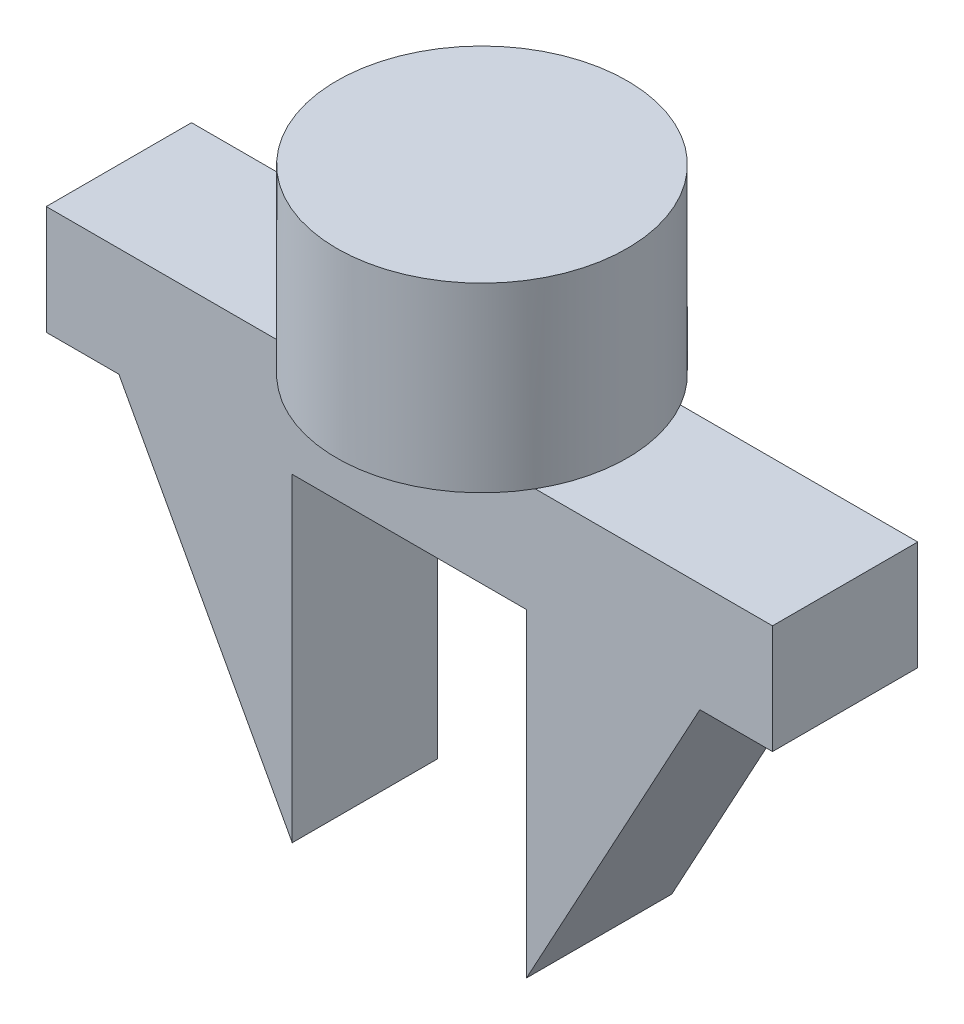
ISO-10303-21;
HEADER;
FILE_DESCRIPTION(('STEP AP214'),'2;1');
FILE_NAME('part.step','',(''),(''),'','','');
FILE_SCHEMA(('AUTOMOTIVE_DESIGN { 1 0 10303 214 1 1 1 1 }'));
ENDSEC;
DATA;
#1=APPLICATION_CONTEXT('core data for automotive mechanical design processes');
#2=APPLICATION_PROTOCOL_DEFINITION('international standard','automotive_design',2000,#1);
#3=PRODUCT_CONTEXT('',#1,'mechanical');
#4=PRODUCT('Part','Part','',(#3));
#5=PRODUCT_RELATED_PRODUCT_CATEGORY('part','',(#4));
#6=PRODUCT_DEFINITION_FORMATION('','',#4);
#7=PRODUCT_DEFINITION_CONTEXT('part definition',#1,'design');
#8=PRODUCT_DEFINITION('design','',#6,#7);
#9=PRODUCT_DEFINITION_SHAPE('','',#8);
#10=(LENGTH_UNIT() NAMED_UNIT(*) SI_UNIT(.MILLI.,.METRE.));
#11=(NAMED_UNIT(*) PLANE_ANGLE_UNIT() SI_UNIT($,.RADIAN.));
#12=(NAMED_UNIT(*) SI_UNIT($,.STERADIAN.) SOLID_ANGLE_UNIT());
#13=UNCERTAINTY_MEASURE_WITH_UNIT(LENGTH_MEASURE(1.E-05),#10,'distance_accuracy_value','');
#14=(GEOMETRIC_REPRESENTATION_CONTEXT(3) GLOBAL_UNCERTAINTY_ASSIGNED_CONTEXT((#13)) GLOBAL_UNIT_ASSIGNED_CONTEXT((#10,
#11,#12)) REPRESENTATION_CONTEXT('',''));
#15=CARTESIAN_POINT('',(0.,0.,0.));
#16=DIRECTION('',(0.,0.,1.));
#17=DIRECTION('',(1.,0.,0.));
#18=AXIS2_PLACEMENT_3D('',#15,#16,#17);
#19=CARTESIAN_POINT('',(0.,0.,20.));
#20=DIRECTION('',(0.,-1.,0.));
#21=DIRECTION('',(0.,0.,-1.));
#22=AXIS2_PLACEMENT_3D('',#19,#20,#21);
#23=PLANE('',#22);
#24=CARTESIAN_POINT('',(0.,0.,10.));
#25=DIRECTION('',(0.,1.,0.));
#26=DIRECTION('',(0.,0.,1.));
#27=AXIS2_PLACEMENT_3D('',#24,#25,#26);
#28=CIRCLE('',#27,20.);
#29=CARTESIAN_POINT('',(17.3205080756888,0.,20.));
#30=VERTEX_POINT('',#29);
#31=CARTESIAN_POINT('',(17.3205080756888,0.,0.));
#32=VERTEX_POINT('',#31);
#33=EDGE_CURVE('E47',#30,#32,#28,.T.);
#34=ORIENTED_EDGE('',*,*,#33,.F.);
#35=DIRECTION('',(-1.,0.,0.));
#36=VECTOR('',#35,1.);
#37=CARTESIAN_POINT('',(0.,0.,20.));
#38=LINE('',#37,#36);
#39=CARTESIAN_POINT('',(50.,0.,20.));
#40=VERTEX_POINT('',#39);
#41=EDGE_CURVE('E133',#40,#30,#38,.T.);
#42=ORIENTED_EDGE('',*,*,#41,.F.);
#43=DIRECTION('',(0.,0.,-1.));
#44=VECTOR('',#43,1.);
#45=CARTESIAN_POINT('',(50.,0.,20.));
#46=LINE('',#45,#44);
#47=CARTESIAN_POINT('',(50.,0.,0.));
#48=VERTEX_POINT('',#47);
#49=EDGE_CURVE('E215',#40,#48,#46,.T.);
#50=ORIENTED_EDGE('',*,*,#49,.T.);
#51=DIRECTION('',(-1.,0.,0.));
#52=VECTOR('',#51,1.);
#53=CARTESIAN_POINT('',(0.,0.,0.));
#54=LINE('',#53,#52);
#55=EDGE_CURVE('E193',#48,#32,#54,.T.);
#56=ORIENTED_EDGE('',*,*,#55,.T.);
#57=EDGE_LOOP('',(#34,#42,#50,#56));
#58=FACE_BOUND('',#57,.T.);
#59=ADVANCED_FACE('F37',(#58),#23,.F.);
#60=CARTESIAN_POINT('',(0.,-15.,20.));
#61=DIRECTION('',(0.,1.,0.));
#62=DIRECTION('',(0.,0.,1.));
#63=AXIS2_PLACEMENT_3D('',#60,#61,#62);
#64=PLANE('',#63);
#65=DIRECTION('',(1.,0.,0.));
#66=VECTOR('',#65,1.);
#67=CARTESIAN_POINT('',(0.,-15.,0.));
#68=LINE('',#67,#66);
#69=CARTESIAN_POINT('',(-16.1276932074143,-15.,0.));
#70=VERTEX_POINT('',#69);
#71=CARTESIAN_POINT('',(16.1276932074143,-15.,0.));
#72=VERTEX_POINT('',#71);
#73=EDGE_CURVE('E177',#70,#72,#68,.T.);
#74=ORIENTED_EDGE('',*,*,#73,.T.);
#75=DIRECTION('',(0.,0.,-1.));
#76=VECTOR('',#75,1.);
#77=CARTESIAN_POINT('',(16.1276932074143,-15.,20.));
#78=LINE('',#77,#76);
#79=CARTESIAN_POINT('',(16.1276932074143,-15.,20.));
#80=VERTEX_POINT('',#79);
#81=EDGE_CURVE('E41',#80,#72,#78,.T.);
#82=ORIENTED_EDGE('',*,*,#81,.F.);
#83=DIRECTION('',(1.,0.,0.));
#84=VECTOR('',#83,1.);
#85=CARTESIAN_POINT('',(0.,-15.,20.));
#86=LINE('',#85,#84);
#87=CARTESIAN_POINT('',(-16.1276932074143,-15.,20.));
#88=VERTEX_POINT('',#87);
#89=EDGE_CURVE('E154',#88,#80,#86,.T.);
#90=ORIENTED_EDGE('',*,*,#89,.F.);
#91=DIRECTION('',(0.,0.,-1.));
#92=VECTOR('',#91,1.);
#93=CARTESIAN_POINT('',(-16.1276932074143,-15.,20.));
#94=LINE('',#93,#92);
#95=EDGE_CURVE('E176',#88,#70,#94,.T.);
#96=ORIENTED_EDGE('',*,*,#95,.T.);
#97=EDGE_LOOP('',(#74,#82,#90,#96));
#98=FACE_BOUND('',#97,.T.);
#99=ADVANCED_FACE('F39',(#98),#64,.F.);
#100=CARTESIAN_POINT('',(16.1276932074143,0.,20.));
#101=DIRECTION('',(-1.,0.,0.));
#102=DIRECTION('',(0.,0.,1.));
#103=AXIS2_PLACEMENT_3D('',#100,#101,#102);
#104=PLANE('',#103);
#105=DIRECTION('',(0.,1.,0.));
#106=VECTOR('',#105,1.);
#107=CARTESIAN_POINT('',(16.1276932074143,0.,0.));
#108=LINE('',#107,#106);
#109=CARTESIAN_POINT('',(16.1276932074143,-58.9330509798792,0.));
#110=VERTEX_POINT('',#109);
#111=EDGE_CURVE('E180',#110,#72,#108,.T.);
#112=ORIENTED_EDGE('',*,*,#111,.F.);
#113=DIRECTION('',(0.,0.,-1.));
#114=VECTOR('',#113,1.);
#115=CARTESIAN_POINT('',(16.1276932074143,-58.9330509798792,20.));
#116=LINE('',#115,#114);
#117=CARTESIAN_POINT('',(16.1276932074143,-58.9330509798792,20.));
#118=VERTEX_POINT('',#117);
#119=EDGE_CURVE('E220',#118,#110,#116,.T.);
#120=ORIENTED_EDGE('',*,*,#119,.F.);
#121=DIRECTION('',(0.,1.,0.));
#122=VECTOR('',#121,1.);
#123=CARTESIAN_POINT('',(16.1276932074143,0.,20.));
#124=LINE('',#123,#122);
#125=EDGE_CURVE('E156',#118,#80,#124,.T.);
#126=ORIENTED_EDGE('',*,*,#125,.T.);
#127=ORIENTED_EDGE('',*,*,#81,.T.);
#128=EDGE_LOOP('',(#112,#120,#126,#127));
#129=FACE_BOUND('',#128,.T.);
#130=ADVANCED_FACE('F226',(#129),#104,.T.);
#131=CARTESIAN_POINT('',(37.1745071223666,-20.1998545308118,20.));
#132=DIRECTION('',(0.878661019597584,-0.477446135851714,0.));
#133=DIRECTION('',(0.477446135851714,0.878661019597584,0.));
#134=AXIS2_PLACEMENT_3D('',#131,#132,#133);
#135=PLANE('',#134);
#136=DIRECTION('',(-0.477446135851714,-0.878661019597584,0.));
#137=VECTOR('',#136,1.);
#138=CARTESIAN_POINT('',(37.1745071223666,-20.1998545308118,0.));
#139=LINE('',#138,#137);
#140=CARTESIAN_POINT('',(40.,-15.,0.));
#141=VERTEX_POINT('',#140);
#142=EDGE_CURVE('E183',#141,#110,#139,.T.);
#143=ORIENTED_EDGE('',*,*,#142,.F.);
#144=DIRECTION('',(0.,0.,-1.));
#145=VECTOR('',#144,1.);
#146=CARTESIAN_POINT('',(40.,-15.,20.));
#147=LINE('',#146,#145);
#148=CARTESIAN_POINT('',(40.,-15.,20.));
#149=VERTEX_POINT('',#148);
#150=EDGE_CURVE('E219',#149,#141,#147,.T.);
#151=ORIENTED_EDGE('',*,*,#150,.F.);
#152=DIRECTION('',(-0.477446135851714,-0.878661019597584,0.));
#153=VECTOR('',#152,1.);
#154=CARTESIAN_POINT('',(37.1745071223666,-20.1998545308118,20.));
#155=LINE('',#154,#153);
#156=EDGE_CURVE('E160',#149,#118,#155,.T.);
#157=ORIENTED_EDGE('',*,*,#156,.T.);
#158=ORIENTED_EDGE('',*,*,#119,.T.);
#159=EDGE_LOOP('',(#143,#151,#157,#158));
#160=FACE_BOUND('',#159,.T.);
#161=ADVANCED_FACE('F236',(#160),#135,.T.);
#162=CARTESIAN_POINT('',(0.,-15.,20.));
#163=DIRECTION('',(0.,-1.,0.));
#164=DIRECTION('',(0.,0.,-1.));
#165=AXIS2_PLACEMENT_3D('',#162,#163,#164);
#166=PLANE('',#165);
#167=DIRECTION('',(-1.,0.,0.));
#168=VECTOR('',#167,1.);
#169=CARTESIAN_POINT('',(0.,-15.,0.));
#170=LINE('',#169,#168);
#171=CARTESIAN_POINT('',(50.,-15.,0.));
#172=VERTEX_POINT('',#171);
#173=EDGE_CURVE('E186',#172,#141,#170,.T.);
#174=ORIENTED_EDGE('',*,*,#173,.F.);
#175=DIRECTION('',(0.,0.,-1.));
#176=VECTOR('',#175,1.);
#177=CARTESIAN_POINT('',(50.,-15.,20.));
#178=LINE('',#177,#176);
#179=CARTESIAN_POINT('',(50.,-15.,20.));
#180=VERTEX_POINT('',#179);
#181=EDGE_CURVE('E217',#180,#172,#178,.T.);
#182=ORIENTED_EDGE('',*,*,#181,.F.);
#183=DIRECTION('',(-1.,0.,0.));
#184=VECTOR('',#183,1.);
#185=CARTESIAN_POINT('',(0.,-15.,20.));
#186=LINE('',#185,#184);
#187=EDGE_CURVE('E163',#180,#149,#186,.T.);
#188=ORIENTED_EDGE('',*,*,#187,.T.);
#189=ORIENTED_EDGE('',*,*,#150,.T.);
#190=EDGE_LOOP('',(#174,#182,#188,#189));
#191=FACE_BOUND('',#190,.T.);
#192=ADVANCED_FACE('F240',(#191),#166,.T.);
#193=CARTESIAN_POINT('',(50.,0.,20.));
#194=DIRECTION('',(1.,0.,0.));
#195=DIRECTION('',(0.,0.,-1.));
#196=AXIS2_PLACEMENT_3D('',#193,#194,#195);
#197=PLANE('',#196);
#198=DIRECTION('',(0.,-1.,0.));
#199=VECTOR('',#198,1.);
#200=CARTESIAN_POINT('',(50.,0.,0.));
#201=LINE('',#200,#199);
#202=EDGE_CURVE('E189',#48,#172,#201,.T.);
#203=ORIENTED_EDGE('',*,*,#202,.F.);
#204=ORIENTED_EDGE('',*,*,#49,.F.);
#205=DIRECTION('',(0.,-1.,0.));
#206=VECTOR('',#205,1.);
#207=CARTESIAN_POINT('',(50.,0.,20.));
#208=LINE('',#207,#206);
#209=EDGE_CURVE('E142',#40,#180,#208,.T.);
#210=ORIENTED_EDGE('',*,*,#209,.T.);
#211=ORIENTED_EDGE('',*,*,#181,.T.);
#212=EDGE_LOOP('',(#203,#204,#210,#211));
#213=FACE_BOUND('',#212,.T.);
#214=ADVANCED_FACE('F243',(#213),#197,.T.);
#215=CARTESIAN_POINT('',(-17.3205080756888,0.,0.));
#216=VERTEX_POINT('',#215);
#217=CARTESIAN_POINT('',(-17.3205080756888,0.,20.));
#218=VERTEX_POINT('',#217);
#219=EDGE_CURVE('E11',#216,#218,#28,.T.);
#220=ORIENTED_EDGE('',*,*,#219,.F.);
#221=CARTESIAN_POINT('',(-50.,0.,0.));
#222=VERTEX_POINT('',#221);
#223=EDGE_CURVE('E192',#216,#222,#54,.T.);
#224=ORIENTED_EDGE('',*,*,#223,.T.);
#225=DIRECTION('',(0.,0.,-1.));
#226=VECTOR('',#225,1.);
#227=CARTESIAN_POINT('',(-50.,0.,20.));
#228=LINE('',#227,#226);
#229=CARTESIAN_POINT('',(-50.,0.,20.));
#230=VERTEX_POINT('',#229);
#231=EDGE_CURVE('E140',#230,#222,#228,.T.);
#232=ORIENTED_EDGE('',*,*,#231,.F.);
#233=EDGE_CURVE('E130',#218,#230,#38,.T.);
#234=ORIENTED_EDGE('',*,*,#233,.F.);
#235=EDGE_LOOP('',(#220,#224,#232,#234));
#236=FACE_BOUND('',#235,.T.);
#237=ADVANCED_FACE('F138',(#236),#23,.F.);
#238=CARTESIAN_POINT('',(-50.,0.,20.));
#239=DIRECTION('',(1.,0.,0.));
#240=DIRECTION('',(0.,0.,-1.));
#241=AXIS2_PLACEMENT_3D('',#238,#239,#240);
#242=PLANE('',#241);
#243=DIRECTION('',(0.,-1.,0.));
#244=VECTOR('',#243,1.);
#245=CARTESIAN_POINT('',(-50.,0.,0.));
#246=LINE('',#245,#244);
#247=CARTESIAN_POINT('',(-50.,-15.,0.));
#248=VERTEX_POINT('',#247);
#249=EDGE_CURVE('E195',#222,#248,#246,.T.);
#250=ORIENTED_EDGE('',*,*,#249,.T.);
#251=DIRECTION('',(0.,0.,-1.));
#252=VECTOR('',#251,1.);
#253=CARTESIAN_POINT('',(-50.,-15.,20.));
#254=LINE('',#253,#252);
#255=CARTESIAN_POINT('',(-50.,-15.,20.));
#256=VERTEX_POINT('',#255);
#257=EDGE_CURVE('E211',#256,#248,#254,.T.);
#258=ORIENTED_EDGE('',*,*,#257,.F.);
#259=DIRECTION('',(0.,-1.,0.));
#260=VECTOR('',#259,1.);
#261=CARTESIAN_POINT('',(-50.,0.,20.));
#262=LINE('',#261,#260);
#263=EDGE_CURVE('E168',#230,#256,#262,.T.);
#264=ORIENTED_EDGE('',*,*,#263,.F.);
#265=ORIENTED_EDGE('',*,*,#231,.T.);
#266=EDGE_LOOP('',(#250,#258,#264,#265));
#267=FACE_BOUND('',#266,.T.);
#268=ADVANCED_FACE('F253',(#267),#242,.F.);
#269=CARTESIAN_POINT('',(0.,-15.,20.));
#270=DIRECTION('',(0.,1.,0.));
#271=DIRECTION('',(0.,0.,1.));
#272=AXIS2_PLACEMENT_3D('',#269,#270,#271);
#273=PLANE('',#272);
#274=DIRECTION('',(1.,0.,0.));
#275=VECTOR('',#274,1.);
#276=CARTESIAN_POINT('',(0.,-15.,0.));
#277=LINE('',#276,#275);
#278=CARTESIAN_POINT('',(-40.,-15.,0.));
#279=VERTEX_POINT('',#278);
#280=EDGE_CURVE('E198',#248,#279,#277,.T.);
#281=ORIENTED_EDGE('',*,*,#280,.T.);
#282=DIRECTION('',(0.,0.,-1.));
#283=VECTOR('',#282,1.);
#284=CARTESIAN_POINT('',(-40.,-15.,20.));
#285=LINE('',#284,#283);
#286=CARTESIAN_POINT('',(-40.,-15.,20.));
#287=VERTEX_POINT('',#286);
#288=EDGE_CURVE('E208',#287,#279,#285,.T.);
#289=ORIENTED_EDGE('',*,*,#288,.F.);
#290=DIRECTION('',(1.,0.,0.));
#291=VECTOR('',#290,1.);
#292=CARTESIAN_POINT('',(0.,-15.,20.));
#293=LINE('',#292,#291);
#294=EDGE_CURVE('E170',#256,#287,#293,.T.);
#295=ORIENTED_EDGE('',*,*,#294,.F.);
#296=ORIENTED_EDGE('',*,*,#257,.T.);
#297=EDGE_LOOP('',(#281,#289,#295,#296));
#298=FACE_BOUND('',#297,.T.);
#299=ADVANCED_FACE('F258',(#298),#273,.F.);
#300=CARTESIAN_POINT('',(-37.1745071223666,-20.1998545308118,20.));
#301=DIRECTION('',(0.878661019597584,0.477446135851714,0.));
#302=DIRECTION('',(-0.477446135851714,0.878661019597584,0.));
#303=AXIS2_PLACEMENT_3D('',#300,#301,#302);
#304=PLANE('',#303);
#305=DIRECTION('',(0.477446135851714,-0.878661019597584,0.));
#306=VECTOR('',#305,1.);
#307=CARTESIAN_POINT('',(-37.1745071223666,-20.1998545308118,0.));
#308=LINE('',#307,#306);
#309=CARTESIAN_POINT('',(-16.1276932074143,-58.9330509798792,0.));
#310=VERTEX_POINT('',#309);
#311=EDGE_CURVE('E200',#279,#310,#308,.T.);
#312=ORIENTED_EDGE('',*,*,#311,.T.);
#313=DIRECTION('',(0.,0.,-1.));
#314=VECTOR('',#313,1.);
#315=CARTESIAN_POINT('',(-16.1276932074143,-58.9330509798792,20.));
#316=LINE('',#315,#314);
#317=CARTESIAN_POINT('',(-16.1276932074143,-58.9330509798792,20.));
#318=VERTEX_POINT('',#317);
#319=EDGE_CURVE('E205',#318,#310,#316,.T.);
#320=ORIENTED_EDGE('',*,*,#319,.F.);
#321=DIRECTION('',(0.477446135851714,-0.878661019597584,0.));
#322=VECTOR('',#321,1.);
#323=CARTESIAN_POINT('',(-37.1745071223666,-20.1998545308118,20.));
#324=LINE('',#323,#322);
#325=EDGE_CURVE('E172',#287,#318,#324,.T.);
#326=ORIENTED_EDGE('',*,*,#325,.F.);
#327=ORIENTED_EDGE('',*,*,#288,.T.);
#328=EDGE_LOOP('',(#312,#320,#326,#327));
#329=FACE_BOUND('',#328,.T.);
#330=ADVANCED_FACE('F299',(#329),#304,.F.);
#331=CARTESIAN_POINT('',(-16.1276932074143,0.,20.));
#332=DIRECTION('',(-1.,0.,0.));
#333=DIRECTION('',(0.,0.,1.));
#334=AXIS2_PLACEMENT_3D('',#331,#332,#333);
#335=PLANE('',#334);
#336=DIRECTION('',(0.,1.,0.));
#337=VECTOR('',#336,1.);
#338=CARTESIAN_POINT('',(-16.1276932074143,0.,0.));
#339=LINE('',#338,#337);
#340=EDGE_CURVE('E157',#310,#70,#339,.T.);
#341=ORIENTED_EDGE('',*,*,#340,.T.);
#342=ORIENTED_EDGE('',*,*,#95,.F.);
#343=DIRECTION('',(0.,1.,0.));
#344=VECTOR('',#343,1.);
#345=CARTESIAN_POINT('',(-16.1276932074143,0.,20.));
#346=LINE('',#345,#344);
#347=EDGE_CURVE('E174',#318,#88,#346,.T.);
#348=ORIENTED_EDGE('',*,*,#347,.F.);
#349=ORIENTED_EDGE('',*,*,#319,.T.);
#350=EDGE_LOOP('',(#341,#342,#348,#349));
#351=FACE_BOUND('',#350,.T.);
#352=ADVANCED_FACE('F309',(#351),#335,.F.);
#353=CARTESIAN_POINT('',(0.,0.,20.));
#354=DIRECTION('',(0.,0.,1.));
#355=DIRECTION('',(1.,0.,0.));
#356=AXIS2_PLACEMENT_3D('',#353,#354,#355);
#357=PLANE('',#356);
#358=ORIENTED_EDGE('',*,*,#89,.T.);
#359=ORIENTED_EDGE('',*,*,#125,.F.);
#360=ORIENTED_EDGE('',*,*,#156,.F.);
#361=ORIENTED_EDGE('',*,*,#187,.F.);
#362=ORIENTED_EDGE('',*,*,#209,.F.);
#363=ORIENTED_EDGE('',*,*,#41,.T.);
#364=EDGE_CURVE('E128',#30,#218,#38,.T.);
#365=ORIENTED_EDGE('',*,*,#364,.T.);
#366=ORIENTED_EDGE('',*,*,#233,.T.);
#367=ORIENTED_EDGE('',*,*,#263,.T.);
#368=ORIENTED_EDGE('',*,*,#294,.T.);
#369=ORIENTED_EDGE('',*,*,#325,.T.);
#370=ORIENTED_EDGE('',*,*,#347,.T.);
#371=EDGE_LOOP('',(#358,#359,#360,#361,#362,#363,#365,#366,#367,#368,#369,#370));
#372=FACE_BOUND('',#371,.T.);
#373=ADVANCED_FACE('F129',(#372),#357,.T.);
#374=CARTESIAN_POINT('',(0.,0.,0.));
#375=DIRECTION('',(0.,0.,1.));
#376=DIRECTION('',(1.,0.,0.));
#377=AXIS2_PLACEMENT_3D('',#374,#375,#376);
#378=PLANE('',#377);
#379=ORIENTED_EDGE('',*,*,#73,.F.);
#380=ORIENTED_EDGE('',*,*,#340,.F.);
#381=ORIENTED_EDGE('',*,*,#311,.F.);
#382=ORIENTED_EDGE('',*,*,#280,.F.);
#383=ORIENTED_EDGE('',*,*,#249,.F.);
#384=ORIENTED_EDGE('',*,*,#223,.F.);
#385=EDGE_CURVE('E196',#32,#216,#54,.T.);
#386=ORIENTED_EDGE('',*,*,#385,.F.);
#387=ORIENTED_EDGE('',*,*,#55,.F.);
#388=ORIENTED_EDGE('',*,*,#202,.T.);
#389=ORIENTED_EDGE('',*,*,#173,.T.);
#390=ORIENTED_EDGE('',*,*,#142,.T.);
#391=ORIENTED_EDGE('',*,*,#111,.T.);
#392=EDGE_LOOP('',(#379,#380,#381,#382,#383,#384,#386,#387,#388,#389,#390,#391));
#393=FACE_BOUND('',#392,.T.);
#394=ADVANCED_FACE('F234',(#393),#378,.F.);
#395=CARTESIAN_POINT('',(0.,0.,0.));
#396=DIRECTION('',(0.,1.,0.));
#397=DIRECTION('',(0.,0.,1.));
#398=AXIS2_PLACEMENT_3D('',#395,#396,#397);
#399=PLANE('',#398);
#400=EDGE_CURVE('E48',#32,#216,#28,.T.);
#401=ORIENTED_EDGE('',*,*,#400,.F.);
#402=ORIENTED_EDGE('',*,*,#385,.T.);
#403=EDGE_LOOP('',(#401,#402));
#404=FACE_BOUND('',#403,.T.);
#405=ADVANCED_FACE('F346',(#404),#399,.F.);
#406=CARTESIAN_POINT('',(0.,25.,10.));
#407=DIRECTION('',(0.,-1.,0.));
#408=DIRECTION('',(0.,0.,-1.));
#409=AXIS2_PLACEMENT_3D('',#406,#407,#408);
#410=CYLINDRICAL_SURFACE('',#409,20.);
#411=CARTESIAN_POINT('',(0.,25.,10.));
#412=DIRECTION('',(0.,1.,0.));
#413=DIRECTION('',(0.,0.,1.));
#414=AXIS2_PLACEMENT_3D('',#411,#412,#413);
#415=CIRCLE('',#414,20.);
#416=CARTESIAN_POINT('',(0.,25.,30.));
#417=VERTEX_POINT('',#416);
#418=EDGE_CURVE('E151',#417,#417,#415,.T.);
#419=ORIENTED_EDGE('',*,*,#418,.F.);
#420=EDGE_LOOP('',(#419));
#421=FACE_BOUND('',#420,.T.);
#422=ORIENTED_EDGE('',*,*,#33,.T.);
#423=ORIENTED_EDGE('',*,*,#400,.T.);
#424=ORIENTED_EDGE('',*,*,#219,.T.);
#425=EDGE_CURVE('E143',#218,#30,#28,.T.);
#426=ORIENTED_EDGE('',*,*,#425,.T.);
#427=EDGE_LOOP('',(#422,#423,#424,#426));
#428=FACE_BOUND('',#427,.T.);
#429=ADVANCED_FACE('F147',(#421,#428),#410,.T.);
#430=CARTESIAN_POINT('',(0.,25.,0.));
#431=DIRECTION('',(0.,1.,0.));
#432=DIRECTION('',(0.,0.,1.));
#433=AXIS2_PLACEMENT_3D('',#430,#431,#432);
#434=PLANE('',#433);
#435=ORIENTED_EDGE('',*,*,#418,.T.);
#436=EDGE_LOOP('',(#435));
#437=FACE_BOUND('',#436,.T.);
#438=ADVANCED_FACE('F364',(#437),#434,.T.);
#439=ORIENTED_EDGE('',*,*,#364,.F.);
#440=ORIENTED_EDGE('',*,*,#425,.F.);
#441=EDGE_LOOP('',(#439,#440));
#442=FACE_BOUND('',#441,.T.);
#443=ADVANCED_FACE('F144',(#442),#399,.F.);
#444=CLOSED_SHELL('',(#59,#99,#130,#161,#192,#214,#237,#268,#299,#330,#352,#373,#394,#405,#429,
#438,#443));
#445=MANIFOLD_SOLID_BREP('B2',#444);
#446=ADVANCED_BREP_SHAPE_REPRESENTATION('',(#18,#445),#14);
#447=SHAPE_DEFINITION_REPRESENTATION(#9,#446);
ENDSEC;
END-ISO-10303-21;
